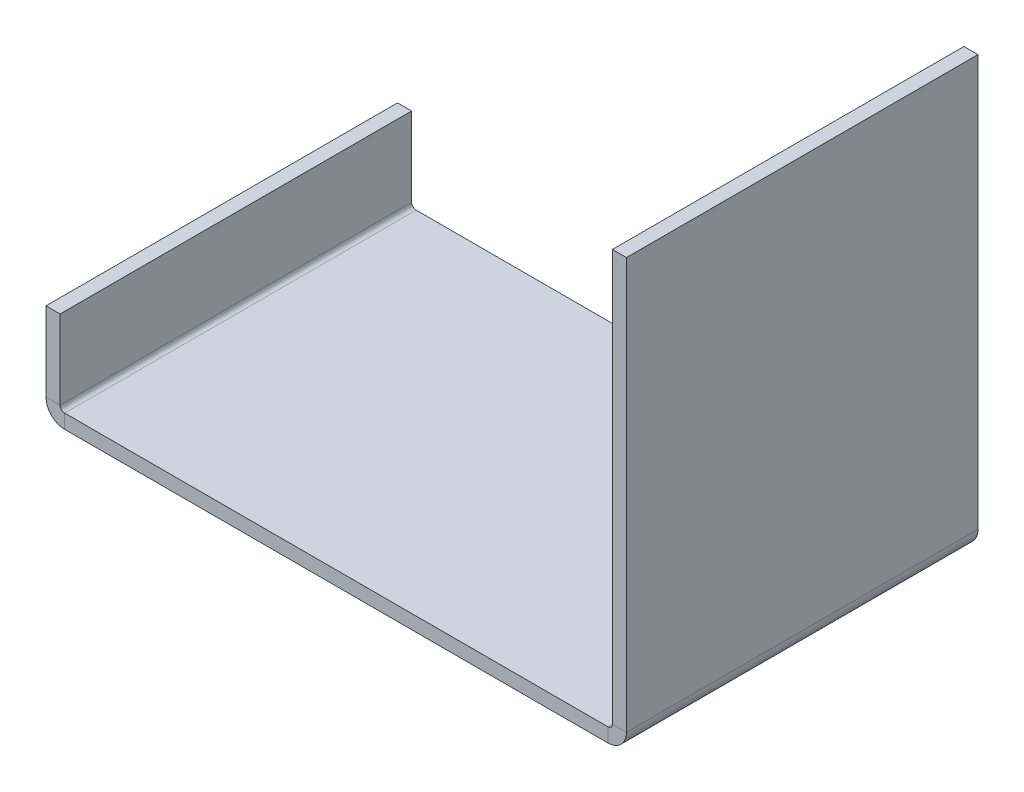
ISO-10303-21;
HEADER;
FILE_DESCRIPTION(('STEP AP214'),'2;1');
FILE_NAME('part.step','',(''),(''),'','','');
FILE_SCHEMA(('AUTOMOTIVE_DESIGN { 1 0 10303 214 1 1 1 1 }'));
ENDSEC;
DATA;
#1=APPLICATION_CONTEXT('core data for automotive mechanical design processes');
#2=APPLICATION_PROTOCOL_DEFINITION('international standard','automotive_design',2000,#1);
#3=PRODUCT_CONTEXT('',#1,'mechanical');
#4=PRODUCT('Part','Part','',(#3));
#5=PRODUCT_RELATED_PRODUCT_CATEGORY('part','',(#4));
#6=PRODUCT_DEFINITION_FORMATION('','',#4);
#7=PRODUCT_DEFINITION_CONTEXT('part definition',#1,'design');
#8=PRODUCT_DEFINITION('design','',#6,#7);
#9=PRODUCT_DEFINITION_SHAPE('','',#8);
#10=(LENGTH_UNIT() NAMED_UNIT(*) SI_UNIT(.MILLI.,.METRE.));
#11=(NAMED_UNIT(*) PLANE_ANGLE_UNIT() SI_UNIT($,.RADIAN.));
#12=(NAMED_UNIT(*) SI_UNIT($,.STERADIAN.) SOLID_ANGLE_UNIT());
#13=UNCERTAINTY_MEASURE_WITH_UNIT(LENGTH_MEASURE(1.E-05),#10,'distance_accuracy_value','');
#14=(GEOMETRIC_REPRESENTATION_CONTEXT(3) GLOBAL_UNCERTAINTY_ASSIGNED_CONTEXT((#13)) GLOBAL_UNIT_ASSIGNED_CONTEXT((#10,
#11,#12)) REPRESENTATION_CONTEXT('',''));
#15=CARTESIAN_POINT('',(0.,0.,0.));
#16=DIRECTION('',(0.,0.,1.));
#17=DIRECTION('',(1.,0.,0.));
#18=AXIS2_PLACEMENT_3D('',#15,#16,#17);
#19=CARTESIAN_POINT('',(0.,-2.286,0.));
#20=DIRECTION('',(0.,-1.,0.));
#21=DIRECTION('',(0.,0.,-1.));
#22=AXIS2_PLACEMENT_3D('',#19,#20,#21);
#23=PLANE('',#22);
#24=DIRECTION('',(-1.,0.,0.));
#25=VECTOR('',#24,1.);
#26=CARTESIAN_POINT('',(-47.1805,-2.286,-28.575));
#27=LINE('',#26,#25);
#28=CARTESIAN_POINT('',(44.1579,-2.286,-28.575));
#29=VERTEX_POINT('',#28);
#30=CARTESIAN_POINT('',(-44.1579,-2.286,-28.575));
#31=VERTEX_POINT('',#30);
#32=EDGE_CURVE('E90',#29,#31,#27,.T.);
#33=ORIENTED_EDGE('',*,*,#32,.F.);
#34=DIRECTION('',(0.,0.,-1.));
#35=VECTOR('',#34,1.);
#36=CARTESIAN_POINT('',(44.1579,-2.286,-28.575));
#37=LINE('',#36,#35);
#38=CARTESIAN_POINT('',(44.1579,-2.286,28.575));
#39=VERTEX_POINT('',#38);
#40=EDGE_CURVE('E327',#29,#39,#37,.F.);
#41=ORIENTED_EDGE('',*,*,#40,.T.);
#42=DIRECTION('',(1.,0.,0.));
#43=VECTOR('',#42,1.);
#44=CARTESIAN_POINT('',(-47.1805,-2.286,28.575));
#45=LINE('',#44,#43);
#46=CARTESIAN_POINT('',(-44.1579,-2.286,28.575));
#47=VERTEX_POINT('',#46);
#48=EDGE_CURVE('E13',#47,#39,#45,.T.);
#49=ORIENTED_EDGE('',*,*,#48,.F.);
#50=DIRECTION('',(0.,0.,1.));
#51=VECTOR('',#50,1.);
#52=CARTESIAN_POINT('',(-44.1579,-2.286,28.575));
#53=LINE('',#52,#51);
#54=EDGE_CURVE('E105',#47,#31,#53,.F.);
#55=ORIENTED_EDGE('',*,*,#54,.T.);
#56=EDGE_LOOP('',(#33,#41,#49,#55));
#57=FACE_BOUND('',#56,.T.);
#58=ADVANCED_FACE('F81',(#57),#23,.T.);
#59=CARTESIAN_POINT('',(0.,0.,0.));
#60=DIRECTION('',(0.,-1.,0.));
#61=DIRECTION('',(0.,0.,-1.));
#62=AXIS2_PLACEMENT_3D('',#59,#60,#61);
#63=PLANE('',#62);
#64=DIRECTION('',(0.,0.,-1.));
#65=VECTOR('',#64,1.);
#66=CARTESIAN_POINT('',(44.1579,0.,-28.575));
#67=LINE('',#66,#65);
#68=CARTESIAN_POINT('',(44.1579,0.,-28.575));
#69=VERTEX_POINT('',#68);
#70=CARTESIAN_POINT('',(44.1579,0.,28.575));
#71=VERTEX_POINT('',#70);
#72=EDGE_CURVE('E199',#69,#71,#67,.F.);
#73=ORIENTED_EDGE('',*,*,#72,.F.);
#74=DIRECTION('',(-1.,0.,0.));
#75=VECTOR('',#74,1.);
#76=CARTESIAN_POINT('',(-47.1805,0.,-28.575));
#77=LINE('',#76,#75);
#78=CARTESIAN_POINT('',(-44.1579,0.,-28.575));
#79=VERTEX_POINT('',#78);
#80=EDGE_CURVE('E188',#69,#79,#77,.T.);
#81=ORIENTED_EDGE('',*,*,#80,.T.);
#82=DIRECTION('',(0.,0.,1.));
#83=VECTOR('',#82,1.);
#84=CARTESIAN_POINT('',(-44.1579,0.,28.575));
#85=LINE('',#84,#83);
#86=CARTESIAN_POINT('',(-44.1579,0.,28.575));
#87=VERTEX_POINT('',#86);
#88=EDGE_CURVE('E149',#87,#79,#85,.F.);
#89=ORIENTED_EDGE('',*,*,#88,.F.);
#90=DIRECTION('',(1.,0.,0.));
#91=VECTOR('',#90,1.);
#92=CARTESIAN_POINT('',(-47.1805,0.,28.575));
#93=LINE('',#92,#91);
#94=EDGE_CURVE('E85',#87,#71,#93,.T.);
#95=ORIENTED_EDGE('',*,*,#94,.T.);
#96=EDGE_LOOP('',(#73,#81,#89,#95));
#97=FACE_BOUND('',#96,.T.);
#98=ADVANCED_FACE('F196',(#97),#63,.F.);
#99=CARTESIAN_POINT('',(-47.1805,-2.286,-28.575));
#100=DIRECTION('',(0.,0.,-1.));
#101=DIRECTION('',(-1.,0.,0.));
#102=AXIS2_PLACEMENT_3D('',#99,#100,#101);
#103=PLANE('',#102);
#104=ORIENTED_EDGE('',*,*,#80,.F.);
#105=DIRECTION('',(0.,-1.,0.));
#106=VECTOR('',#105,1.);
#107=CARTESIAN_POINT('',(44.1579,0.,-28.575));
#108=LINE('',#107,#106);
#109=EDGE_CURVE('E212',#69,#29,#108,.T.);
#110=ORIENTED_EDGE('',*,*,#109,.T.);
#111=ORIENTED_EDGE('',*,*,#32,.T.);
#112=DIRECTION('',(0.,-1.,0.));
#113=VECTOR('',#112,1.);
#114=CARTESIAN_POINT('',(-44.1579,0.,-28.575));
#115=LINE('',#114,#113);
#116=EDGE_CURVE('E185',#79,#31,#115,.T.);
#117=ORIENTED_EDGE('',*,*,#116,.F.);
#118=EDGE_LOOP('',(#104,#110,#111,#117));
#119=FACE_BOUND('',#118,.T.);
#120=ADVANCED_FACE('F83',(#119),#103,.T.);
#121=CARTESIAN_POINT('',(-47.1805,-2.286,28.575));
#122=DIRECTION('',(0.,0.,1.));
#123=DIRECTION('',(1.,0.,0.));
#124=AXIS2_PLACEMENT_3D('',#121,#122,#123);
#125=PLANE('',#124);
#126=DIRECTION('',(0.,-1.,0.));
#127=VECTOR('',#126,1.);
#128=CARTESIAN_POINT('',(44.1579,0.,28.575));
#129=LINE('',#128,#127);
#130=EDGE_CURVE('E176',#71,#39,#129,.T.);
#131=ORIENTED_EDGE('',*,*,#130,.F.);
#132=ORIENTED_EDGE('',*,*,#94,.F.);
#133=DIRECTION('',(0.,-1.,0.));
#134=VECTOR('',#133,1.);
#135=CARTESIAN_POINT('',(-44.1579,0.,28.575));
#136=LINE('',#135,#134);
#137=EDGE_CURVE('E148',#87,#47,#136,.T.);
#138=ORIENTED_EDGE('',*,*,#137,.T.);
#139=ORIENTED_EDGE('',*,*,#48,.T.);
#140=EDGE_LOOP('',(#131,#132,#138,#139));
#141=FACE_BOUND('',#140,.T.);
#142=ADVANCED_FACE('F204',(#141),#125,.T.);
#143=CARTESIAN_POINT('',(-44.1579,0.7366,-28.575));
#144=DIRECTION('',(0.,0.,-1.));
#145=DIRECTION('',(-1.,0.,0.));
#146=AXIS2_PLACEMENT_3D('',#143,#144,#145);
#147=PLANE('',#146);
#148=DIRECTION('',(1.,0.,0.));
#149=VECTOR('',#148,1.);
#150=CARTESIAN_POINT('',(-47.1805,0.736599999999989,-28.575));
#151=LINE('',#150,#149);
#152=CARTESIAN_POINT('',(-44.8945,0.736599999999997,-28.575));
#153=VERTEX_POINT('',#152);
#154=CARTESIAN_POINT('',(-47.1805,0.736599999999989,-28.575));
#155=VERTEX_POINT('',#154);
#156=EDGE_CURVE('E139',#153,#155,#151,.F.);
#157=ORIENTED_EDGE('',*,*,#156,.F.);
#158=CARTESIAN_POINT('',(-44.1579,0.7366,-28.575));
#159=DIRECTION('',(0.,0.,1.));
#160=DIRECTION('',(1.,0.,0.));
#161=AXIS2_PLACEMENT_3D('',#158,#159,#160);
#162=CIRCLE('',#161,0.736599999999997);
#163=EDGE_CURVE('E133',#79,#153,#162,.F.);
#164=ORIENTED_EDGE('',*,*,#163,.F.);
#165=ORIENTED_EDGE('',*,*,#116,.T.);
#166=CARTESIAN_POINT('',(-44.1579,0.7366,-28.575));
#167=DIRECTION('',(0.,0.,1.));
#168=DIRECTION('',(1.,0.,0.));
#169=AXIS2_PLACEMENT_3D('',#166,#167,#168);
#170=CIRCLE('',#169,3.0226);
#171=EDGE_CURVE('E178',#31,#155,#170,.F.);
#172=ORIENTED_EDGE('',*,*,#171,.T.);
#173=EDGE_LOOP('',(#157,#164,#165,#172));
#174=FACE_BOUND('',#173,.T.);
#175=ADVANCED_FACE('F277',(#174),#147,.T.);
#176=CARTESIAN_POINT('',(-44.1579,0.7366,28.575));
#177=DIRECTION('',(0.,0.,-1.));
#178=DIRECTION('',(-1.,0.,0.));
#179=AXIS2_PLACEMENT_3D('',#176,#177,#178);
#180=PLANE('',#179);
#181=CARTESIAN_POINT('',(-44.1579,0.7366,28.575));
#182=DIRECTION('',(0.,0.,1.));
#183=DIRECTION('',(1.,0.,0.));
#184=AXIS2_PLACEMENT_3D('',#181,#182,#183);
#185=CIRCLE('',#184,0.736599999999997);
#186=CARTESIAN_POINT('',(-44.8945,0.736599999999997,28.575));
#187=VERTEX_POINT('',#186);
#188=EDGE_CURVE('E130',#187,#87,#185,.T.);
#189=ORIENTED_EDGE('',*,*,#188,.F.);
#190=DIRECTION('',(1.,0.,0.));
#191=VECTOR('',#190,1.);
#192=CARTESIAN_POINT('',(-44.8945,0.736599999999997,28.575));
#193=LINE('',#192,#191);
#194=CARTESIAN_POINT('',(-47.1805,0.736599999999989,28.575));
#195=VERTEX_POINT('',#194);
#196=EDGE_CURVE('E138',#187,#195,#193,.F.);
#197=ORIENTED_EDGE('',*,*,#196,.T.);
#198=CARTESIAN_POINT('',(-44.1579,0.7366,28.575));
#199=DIRECTION('',(0.,0.,1.));
#200=DIRECTION('',(1.,0.,0.));
#201=AXIS2_PLACEMENT_3D('',#198,#199,#200);
#202=CIRCLE('',#201,3.0226);
#203=EDGE_CURVE('E179',#195,#47,#202,.T.);
#204=ORIENTED_EDGE('',*,*,#203,.T.);
#205=ORIENTED_EDGE('',*,*,#137,.F.);
#206=EDGE_LOOP('',(#189,#197,#204,#205));
#207=FACE_BOUND('',#206,.T.);
#208=ADVANCED_FACE('F144',(#207),#180,.F.);
#209=CARTESIAN_POINT('',(-44.1579,0.7366,28.575));
#210=DIRECTION('',(0.,0.,1.));
#211=DIRECTION('',(-1.,0.,0.));
#212=AXIS2_PLACEMENT_3D('',#209,#210,#211);
#213=CYLINDRICAL_SURFACE('',#212,3.0226);
#214=ORIENTED_EDGE('',*,*,#54,.F.);
#215=ORIENTED_EDGE('',*,*,#203,.F.);
#216=DIRECTION('',(0.,0.,1.));
#217=VECTOR('',#216,1.);
#218=CARTESIAN_POINT('',(-47.1805,0.736599999999989,-28.575));
#219=LINE('',#218,#217);
#220=EDGE_CURVE('E162',#195,#155,#219,.F.);
#221=ORIENTED_EDGE('',*,*,#220,.T.);
#222=ORIENTED_EDGE('',*,*,#171,.F.);
#223=EDGE_LOOP('',(#214,#215,#221,#222));
#224=FACE_BOUND('',#223,.T.);
#225=ADVANCED_FACE('F394',(#224),#213,.T.);
#226=CARTESIAN_POINT('',(-44.1579,0.7366,28.575));
#227=DIRECTION('',(0.,0.,1.));
#228=DIRECTION('',(-1.,0.,0.));
#229=AXIS2_PLACEMENT_3D('',#226,#227,#228);
#230=CYLINDRICAL_SURFACE('',#229,0.736599999999997);
#231=ORIENTED_EDGE('',*,*,#88,.T.);
#232=ORIENTED_EDGE('',*,*,#163,.T.);
#233=DIRECTION('',(0.,0.,1.));
#234=VECTOR('',#233,1.);
#235=CARTESIAN_POINT('',(-44.8945,0.736599999999997,-28.575));
#236=LINE('',#235,#234);
#237=EDGE_CURVE('E126',#153,#187,#236,.T.);
#238=ORIENTED_EDGE('',*,*,#237,.T.);
#239=ORIENTED_EDGE('',*,*,#188,.T.);
#240=EDGE_LOOP('',(#231,#232,#238,#239));
#241=FACE_BOUND('',#240,.T.);
#242=ADVANCED_FACE('F129',(#241),#230,.F.);
#243=CARTESIAN_POINT('',(-47.1805000000001,13.589,28.575));
#244=DIRECTION('',(0.,0.,-1.));
#245=DIRECTION('',(0.,1.,0.));
#246=AXIS2_PLACEMENT_3D('',#243,#244,#245);
#247=PLANE('',#246);
#248=ORIENTED_EDGE('',*,*,#196,.F.);
#249=DIRECTION('',(0.,-1.,0.));
#250=VECTOR('',#249,1.);
#251=CARTESIAN_POINT('',(-44.8945000000001,13.589,28.575));
#252=LINE('',#251,#250);
#253=CARTESIAN_POINT('',(-44.8945000000001,13.589,28.575));
#254=VERTEX_POINT('',#253);
#255=EDGE_CURVE('E158',#187,#254,#252,.F.);
#256=ORIENTED_EDGE('',*,*,#255,.T.);
#257=DIRECTION('',(1.,0.,0.));
#258=VECTOR('',#257,1.);
#259=CARTESIAN_POINT('',(-47.1805000000001,13.589,28.575));
#260=LINE('',#259,#258);
#261=CARTESIAN_POINT('',(-47.1805000000001,13.589,28.575));
#262=VERTEX_POINT('',#261);
#263=EDGE_CURVE('E150',#262,#254,#260,.T.);
#264=ORIENTED_EDGE('',*,*,#263,.F.);
#265=DIRECTION('',(0.,1.,0.));
#266=VECTOR('',#265,1.);
#267=CARTESIAN_POINT('',(-47.1805,-1.83918154016299E-13,28.575));
#268=LINE('',#267,#266);
#269=EDGE_CURVE('E161',#195,#262,#268,.T.);
#270=ORIENTED_EDGE('',*,*,#269,.F.);
#271=EDGE_LOOP('',(#248,#256,#264,#270));
#272=FACE_BOUND('',#271,.T.);
#273=ADVANCED_FACE('F155',(#272),#247,.F.);
#274=CARTESIAN_POINT('',(-47.1805,0.,-28.575));
#275=DIRECTION('',(0.,0.,1.));
#276=DIRECTION('',(0.,-1.,0.));
#277=AXIS2_PLACEMENT_3D('',#274,#275,#276);
#278=PLANE('',#277);
#279=ORIENTED_EDGE('',*,*,#156,.T.);
#280=DIRECTION('',(0.,-1.,0.));
#281=VECTOR('',#280,1.);
#282=CARTESIAN_POINT('',(-47.1805,-1.69327021975373E-13,-28.575));
#283=LINE('',#282,#281);
#284=CARTESIAN_POINT('',(-47.1805000000001,13.589,-28.575));
#285=VERTEX_POINT('',#284);
#286=EDGE_CURVE('E224',#285,#155,#283,.T.);
#287=ORIENTED_EDGE('',*,*,#286,.F.);
#288=DIRECTION('',(1.,0.,0.));
#289=VECTOR('',#288,1.);
#290=CARTESIAN_POINT('',(-47.1805000000001,13.589,-28.575));
#291=LINE('',#290,#289);
#292=CARTESIAN_POINT('',(-44.8945000000001,13.589,-28.575));
#293=VERTEX_POINT('',#292);
#294=EDGE_CURVE('E221',#285,#293,#291,.T.);
#295=ORIENTED_EDGE('',*,*,#294,.T.);
#296=DIRECTION('',(0.,1.,0.));
#297=VECTOR('',#296,1.);
#298=CARTESIAN_POINT('',(-44.8945,0.,-28.575));
#299=LINE('',#298,#297);
#300=EDGE_CURVE('E169',#293,#153,#299,.F.);
#301=ORIENTED_EDGE('',*,*,#300,.T.);
#302=EDGE_LOOP('',(#279,#287,#295,#301));
#303=FACE_BOUND('',#302,.T.);
#304=ADVANCED_FACE('F231',(#303),#278,.F.);
#305=CARTESIAN_POINT('',(-47.1805,-1.76622587995836E-13,0.));
#306=DIRECTION('',(1.,0.,0.));
#307=DIRECTION('',(0.,1.,0.));
#308=AXIS2_PLACEMENT_3D('',#305,#306,#307);
#309=PLANE('',#308);
#310=ORIENTED_EDGE('',*,*,#220,.F.);
#311=ORIENTED_EDGE('',*,*,#269,.T.);
#312=DIRECTION('',(0.,0.,-1.));
#313=VECTOR('',#312,1.);
#314=CARTESIAN_POINT('',(-47.1805000000001,13.589,0.));
#315=LINE('',#314,#313);
#316=EDGE_CURVE('E227',#262,#285,#315,.T.);
#317=ORIENTED_EDGE('',*,*,#316,.T.);
#318=ORIENTED_EDGE('',*,*,#286,.T.);
#319=EDGE_LOOP('',(#310,#311,#317,#318));
#320=FACE_BOUND('',#319,.T.);
#321=ADVANCED_FACE('F253',(#320),#309,.F.);
#322=CARTESIAN_POINT('',(-44.8945,-1.68641061655241E-13,0.));
#323=DIRECTION('',(1.,0.,0.));
#324=DIRECTION('',(0.,1.,0.));
#325=AXIS2_PLACEMENT_3D('',#322,#323,#324);
#326=PLANE('',#325);
#327=ORIENTED_EDGE('',*,*,#255,.F.);
#328=ORIENTED_EDGE('',*,*,#237,.F.);
#329=ORIENTED_EDGE('',*,*,#300,.F.);
#330=DIRECTION('',(0.,0.,1.));
#331=VECTOR('',#330,1.);
#332=CARTESIAN_POINT('',(-44.8945000000001,13.589,-28.575));
#333=LINE('',#332,#331);
#334=EDGE_CURVE('E167',#254,#293,#333,.F.);
#335=ORIENTED_EDGE('',*,*,#334,.F.);
#336=EDGE_LOOP('',(#327,#328,#329,#335));
#337=FACE_BOUND('',#336,.T.);
#338=ADVANCED_FACE('F165',(#337),#326,.T.);
#339=CARTESIAN_POINT('',(-47.1805000000001,13.589,-28.575));
#340=DIRECTION('',(0.,-1.,0.));
#341=DIRECTION('',(1.,0.,0.));
#342=AXIS2_PLACEMENT_3D('',#339,#340,#341);
#343=PLANE('',#342);
#344=ORIENTED_EDGE('',*,*,#334,.T.);
#345=ORIENTED_EDGE('',*,*,#294,.F.);
#346=ORIENTED_EDGE('',*,*,#316,.F.);
#347=ORIENTED_EDGE('',*,*,#263,.T.);
#348=EDGE_LOOP('',(#344,#345,#346,#347));
#349=FACE_BOUND('',#348,.T.);
#350=ADVANCED_FACE('F254',(#349),#343,.F.);
#351=CARTESIAN_POINT('',(44.1579,0.7366,28.575));
#352=DIRECTION('',(0.,0.,1.));
#353=DIRECTION('',(1.,0.,0.));
#354=AXIS2_PLACEMENT_3D('',#351,#352,#353);
#355=PLANE('',#354);
#356=DIRECTION('',(-1.,0.,0.));
#357=VECTOR('',#356,1.);
#358=CARTESIAN_POINT('',(47.1805,0.736599999999989,28.575));
#359=LINE('',#358,#357);
#360=CARTESIAN_POINT('',(44.8945,0.736599999999997,28.575));
#361=VERTEX_POINT('',#360);
#362=CARTESIAN_POINT('',(47.1805,0.736599999999989,28.575));
#363=VERTEX_POINT('',#362);
#364=EDGE_CURVE('E296',#361,#363,#359,.F.);
#365=ORIENTED_EDGE('',*,*,#364,.F.);
#366=CARTESIAN_POINT('',(44.1579,0.7366,28.575));
#367=DIRECTION('',(0.,0.,-1.));
#368=DIRECTION('',(-1.,0.,0.));
#369=AXIS2_PLACEMENT_3D('',#366,#367,#368);
#370=CIRCLE('',#369,0.736599999999997);
#371=EDGE_CURVE('E357',#71,#361,#370,.F.);
#372=ORIENTED_EDGE('',*,*,#371,.F.);
#373=ORIENTED_EDGE('',*,*,#130,.T.);
#374=CARTESIAN_POINT('',(44.1579,0.7366,28.575));
#375=DIRECTION('',(0.,0.,-1.));
#376=DIRECTION('',(-1.,0.,0.));
#377=AXIS2_PLACEMENT_3D('',#374,#375,#376);
#378=CIRCLE('',#377,3.0226);
#379=EDGE_CURVE('E214',#39,#363,#378,.F.);
#380=ORIENTED_EDGE('',*,*,#379,.T.);
#381=EDGE_LOOP('',(#365,#372,#373,#380));
#382=FACE_BOUND('',#381,.T.);
#383=ADVANCED_FACE('F256',(#382),#355,.T.);
#384=CARTESIAN_POINT('',(44.1579,0.7366,-28.575));
#385=DIRECTION('',(0.,0.,1.));
#386=DIRECTION('',(1.,0.,0.));
#387=AXIS2_PLACEMENT_3D('',#384,#385,#386);
#388=PLANE('',#387);
#389=CARTESIAN_POINT('',(44.1579,0.7366,-28.575));
#390=DIRECTION('',(0.,0.,-1.));
#391=DIRECTION('',(-1.,0.,0.));
#392=AXIS2_PLACEMENT_3D('',#389,#390,#391);
#393=CIRCLE('',#392,0.736599999999997);
#394=CARTESIAN_POINT('',(44.8945,0.736599999999997,-28.575));
#395=VERTEX_POINT('',#394);
#396=EDGE_CURVE('E217',#395,#69,#393,.T.);
#397=ORIENTED_EDGE('',*,*,#396,.F.);
#398=DIRECTION('',(-1.,0.,0.));
#399=VECTOR('',#398,1.);
#400=CARTESIAN_POINT('',(44.8945,0.736599999999997,-28.575));
#401=LINE('',#400,#399);
#402=CARTESIAN_POINT('',(47.1805,0.736599999999989,-28.575));
#403=VERTEX_POINT('',#402);
#404=EDGE_CURVE('E325',#395,#403,#401,.F.);
#405=ORIENTED_EDGE('',*,*,#404,.T.);
#406=CARTESIAN_POINT('',(44.1579,0.7366,-28.575));
#407=DIRECTION('',(0.,0.,-1.));
#408=DIRECTION('',(-1.,0.,0.));
#409=AXIS2_PLACEMENT_3D('',#406,#407,#408);
#410=CIRCLE('',#409,3.0226);
#411=EDGE_CURVE('E321',#403,#29,#410,.T.);
#412=ORIENTED_EDGE('',*,*,#411,.T.);
#413=ORIENTED_EDGE('',*,*,#109,.F.);
#414=EDGE_LOOP('',(#397,#405,#412,#413));
#415=FACE_BOUND('',#414,.T.);
#416=ADVANCED_FACE('F262',(#415),#388,.F.);
#417=CARTESIAN_POINT('',(44.1579,0.7366,-28.575));
#418=DIRECTION('',(0.,0.,-1.));
#419=DIRECTION('',(1.,0.,0.));
#420=AXIS2_PLACEMENT_3D('',#417,#418,#419);
#421=CYLINDRICAL_SURFACE('',#420,3.0226);
#422=ORIENTED_EDGE('',*,*,#40,.F.);
#423=ORIENTED_EDGE('',*,*,#411,.F.);
#424=DIRECTION('',(0.,0.,-1.));
#425=VECTOR('',#424,1.);
#426=CARTESIAN_POINT('',(47.1805,0.736599999999989,28.575));
#427=LINE('',#426,#425);
#428=EDGE_CURVE('E319',#403,#363,#427,.F.);
#429=ORIENTED_EDGE('',*,*,#428,.T.);
#430=ORIENTED_EDGE('',*,*,#379,.F.);
#431=EDGE_LOOP('',(#422,#423,#429,#430));
#432=FACE_BOUND('',#431,.T.);
#433=ADVANCED_FACE('F320',(#432),#421,.T.);
#434=CARTESIAN_POINT('',(44.1579,0.7366,-28.575));
#435=DIRECTION('',(0.,0.,-1.));
#436=DIRECTION('',(1.,0.,0.));
#437=AXIS2_PLACEMENT_3D('',#434,#435,#436);
#438=CYLINDRICAL_SURFACE('',#437,0.736599999999997);
#439=ORIENTED_EDGE('',*,*,#72,.T.);
#440=ORIENTED_EDGE('',*,*,#371,.T.);
#441=DIRECTION('',(0.,0.,-1.));
#442=VECTOR('',#441,1.);
#443=CARTESIAN_POINT('',(44.8945,0.736599999999997,28.575));
#444=LINE('',#443,#442);
#445=EDGE_CURVE('E337',#361,#395,#444,.T.);
#446=ORIENTED_EDGE('',*,*,#445,.T.);
#447=ORIENTED_EDGE('',*,*,#396,.T.);
#448=EDGE_LOOP('',(#439,#440,#446,#447));
#449=FACE_BOUND('',#448,.T.);
#450=ADVANCED_FACE('F369',(#449),#438,.F.);
#451=CARTESIAN_POINT('',(47.1805000000002,67.564,-28.575));
#452=DIRECTION('',(0.,0.,1.));
#453=DIRECTION('',(1.,0.,0.));
#454=AXIS2_PLACEMENT_3D('',#451,#452,#453);
#455=PLANE('',#454);
#456=ORIENTED_EDGE('',*,*,#404,.F.);
#457=DIRECTION('',(0.,-1.,0.));
#458=VECTOR('',#457,1.);
#459=CARTESIAN_POINT('',(44.8945000000002,67.564,-28.575));
#460=LINE('',#459,#458);
#461=CARTESIAN_POINT('',(44.8945000000002,67.564,-28.575));
#462=VERTEX_POINT('',#461);
#463=EDGE_CURVE('E324',#395,#462,#460,.F.);
#464=ORIENTED_EDGE('',*,*,#463,.T.);
#465=DIRECTION('',(-1.,0.,0.));
#466=VECTOR('',#465,1.);
#467=CARTESIAN_POINT('',(47.1805000000002,67.564,-28.575));
#468=LINE('',#467,#466);
#469=CARTESIAN_POINT('',(47.1805000000002,67.564,-28.575));
#470=VERTEX_POINT('',#469);
#471=EDGE_CURVE('E342',#470,#462,#468,.T.);
#472=ORIENTED_EDGE('',*,*,#471,.F.);
#473=DIRECTION('',(0.,1.,0.));
#474=VECTOR('',#473,1.);
#475=CARTESIAN_POINT('',(47.1805,-1.72728084423776E-13,-28.575));
#476=LINE('',#475,#474);
#477=EDGE_CURVE('E344',#403,#470,#476,.T.);
#478=ORIENTED_EDGE('',*,*,#477,.F.);
#479=EDGE_LOOP('',(#456,#464,#472,#478));
#480=FACE_BOUND('',#479,.T.);
#481=ADVANCED_FACE('F371',(#480),#455,.F.);
#482=CARTESIAN_POINT('',(47.1805,0.,28.575));
#483=DIRECTION('',(0.,0.,-1.));
#484=DIRECTION('',(-1.,0.,0.));
#485=AXIS2_PLACEMENT_3D('',#482,#483,#484);
#486=PLANE('',#485);
#487=ORIENTED_EDGE('',*,*,#364,.T.);
#488=DIRECTION('',(0.,-1.,0.));
#489=VECTOR('',#488,1.);
#490=CARTESIAN_POINT('',(47.1805,-1.72728084423776E-13,28.575));
#491=LINE('',#490,#489);
#492=CARTESIAN_POINT('',(47.1805000000002,67.564,28.575));
#493=VERTEX_POINT('',#492);
#494=EDGE_CURVE('E334',#493,#363,#491,.T.);
#495=ORIENTED_EDGE('',*,*,#494,.F.);
#496=DIRECTION('',(-1.,0.,0.));
#497=VECTOR('',#496,1.);
#498=CARTESIAN_POINT('',(47.1805000000002,67.564,28.575));
#499=LINE('',#498,#497);
#500=CARTESIAN_POINT('',(44.8945000000002,67.564,28.575));
#501=VERTEX_POINT('',#500);
#502=EDGE_CURVE('E340',#493,#501,#499,.T.);
#503=ORIENTED_EDGE('',*,*,#502,.T.);
#504=DIRECTION('',(0.,1.,0.));
#505=VECTOR('',#504,1.);
#506=CARTESIAN_POINT('',(44.8945,0.,28.575));
#507=LINE('',#506,#505);
#508=EDGE_CURVE('E336',#501,#361,#507,.F.);
#509=ORIENTED_EDGE('',*,*,#508,.T.);
#510=EDGE_LOOP('',(#487,#495,#503,#509));
#511=FACE_BOUND('',#510,.T.);
#512=ADVANCED_FACE('F332',(#511),#486,.F.);
#513=CARTESIAN_POINT('',(47.1805,-1.72728084423776E-13,0.));
#514=DIRECTION('',(-1.,0.,0.));
#515=DIRECTION('',(0.,-1.,0.));
#516=AXIS2_PLACEMENT_3D('',#513,#514,#515);
#517=PLANE('',#516);
#518=ORIENTED_EDGE('',*,*,#428,.F.);
#519=ORIENTED_EDGE('',*,*,#477,.T.);
#520=DIRECTION('',(0.,0.,1.));
#521=VECTOR('',#520,1.);
#522=CARTESIAN_POINT('',(47.1805000000002,67.564,0.));
#523=LINE('',#522,#521);
#524=EDGE_CURVE('E305',#470,#493,#523,.T.);
#525=ORIENTED_EDGE('',*,*,#524,.T.);
#526=ORIENTED_EDGE('',*,*,#494,.T.);
#527=EDGE_LOOP('',(#518,#519,#525,#526));
#528=FACE_BOUND('',#527,.T.);
#529=ADVANCED_FACE('F339',(#528),#517,.F.);
#530=CARTESIAN_POINT('',(44.8945,-1.64746558083181E-13,0.));
#531=DIRECTION('',(-1.,0.,0.));
#532=DIRECTION('',(0.,-1.,0.));
#533=AXIS2_PLACEMENT_3D('',#530,#531,#532);
#534=PLANE('',#533);
#535=ORIENTED_EDGE('',*,*,#463,.F.);
#536=ORIENTED_EDGE('',*,*,#445,.F.);
#537=ORIENTED_EDGE('',*,*,#508,.F.);
#538=DIRECTION('',(0.,0.,-1.));
#539=VECTOR('',#538,1.);
#540=CARTESIAN_POINT('',(44.8945000000002,67.564,28.575));
#541=LINE('',#540,#539);
#542=EDGE_CURVE('E350',#462,#501,#541,.F.);
#543=ORIENTED_EDGE('',*,*,#542,.F.);
#544=EDGE_LOOP('',(#535,#536,#537,#543));
#545=FACE_BOUND('',#544,.T.);
#546=ADVANCED_FACE('F367',(#545),#534,.T.);
#547=CARTESIAN_POINT('',(47.1805000000002,67.564,28.575));
#548=DIRECTION('',(0.,-1.,0.));
#549=DIRECTION('',(1.,0.,0.));
#550=AXIS2_PLACEMENT_3D('',#547,#548,#549);
#551=PLANE('',#550);
#552=ORIENTED_EDGE('',*,*,#542,.T.);
#553=ORIENTED_EDGE('',*,*,#502,.F.);
#554=ORIENTED_EDGE('',*,*,#524,.F.);
#555=ORIENTED_EDGE('',*,*,#471,.T.);
#556=EDGE_LOOP('',(#552,#553,#554,#555));
#557=FACE_BOUND('',#556,.T.);
#558=ADVANCED_FACE('F363',(#557),#551,.F.);
#559=CLOSED_SHELL('',(#58,#98,#120,#142,#175,#208,#225,#242,#273,#304,#321,#338,#350,#383,#416,
#433,#450,#481,#512,#529,#546,#558));
#560=MANIFOLD_SOLID_BREP('B2',#559);
#561=ADVANCED_BREP_SHAPE_REPRESENTATION('',(#18,#560),#14);
#562=SHAPE_DEFINITION_REPRESENTATION(#9,#561);
ENDSEC;
END-ISO-10303-21;
